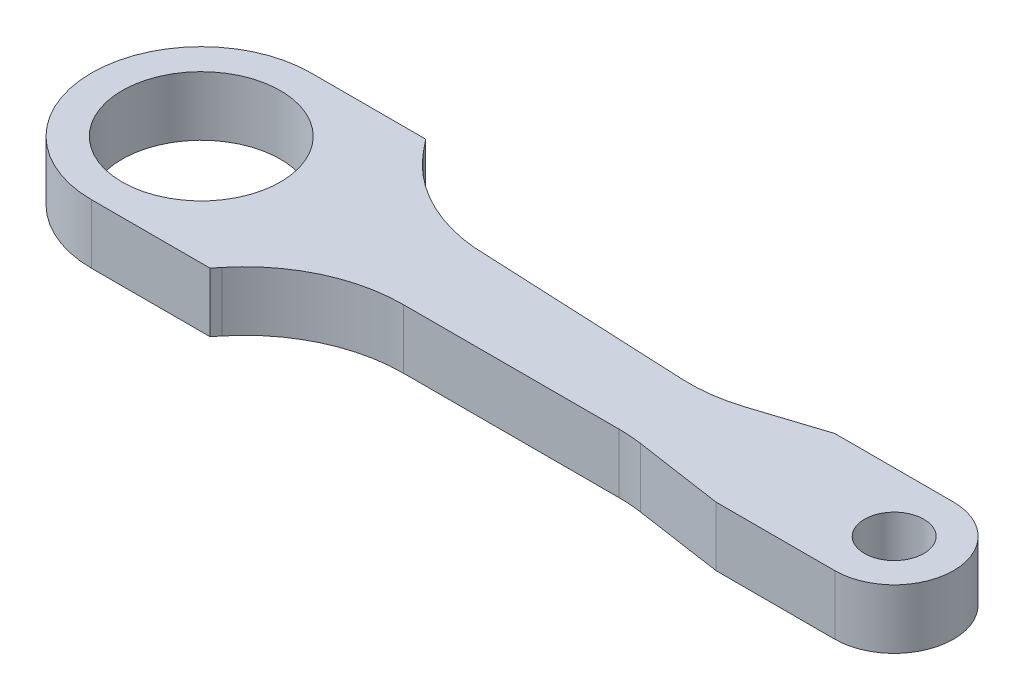
ISO-10303-21;
HEADER;
FILE_DESCRIPTION(('STEP AP214'),'2;1');
FILE_NAME('part.step','',(''),(''),'','','');
FILE_SCHEMA(('AUTOMOTIVE_DESIGN { 1 0 10303 214 1 1 1 1 }'));
ENDSEC;
DATA;
#1=APPLICATION_CONTEXT('core data for automotive mechanical design processes');
#2=APPLICATION_PROTOCOL_DEFINITION('international standard','automotive_design',2000,#1);
#3=PRODUCT_CONTEXT('',#1,'mechanical');
#4=PRODUCT('Part','Part','',(#3));
#5=PRODUCT_RELATED_PRODUCT_CATEGORY('part','',(#4));
#6=PRODUCT_DEFINITION_FORMATION('','',#4);
#7=PRODUCT_DEFINITION_CONTEXT('part definition',#1,'design');
#8=PRODUCT_DEFINITION('design','',#6,#7);
#9=PRODUCT_DEFINITION_SHAPE('','',#8);
#10=(LENGTH_UNIT() NAMED_UNIT(*) SI_UNIT(.MILLI.,.METRE.));
#11=(NAMED_UNIT(*) PLANE_ANGLE_UNIT() SI_UNIT($,.RADIAN.));
#12=(NAMED_UNIT(*) SI_UNIT($,.STERADIAN.) SOLID_ANGLE_UNIT());
#13=UNCERTAINTY_MEASURE_WITH_UNIT(LENGTH_MEASURE(1.E-05),#10,'distance_accuracy_value','');
#14=(GEOMETRIC_REPRESENTATION_CONTEXT(3) GLOBAL_UNCERTAINTY_ASSIGNED_CONTEXT((#13)) GLOBAL_UNIT_ASSIGNED_CONTEXT((#10,
#11,#12)) REPRESENTATION_CONTEXT('',''));
#15=CARTESIAN_POINT('',(0.,0.,0.));
#16=DIRECTION('',(0.,0.,1.));
#17=DIRECTION('',(1.,0.,0.));
#18=AXIS2_PLACEMENT_3D('',#15,#16,#17);
#19=CARTESIAN_POINT('',(-8.40404092998309,3.,-10.));
#20=DIRECTION('',(0.,-1.,0.));
#21=DIRECTION('',(0.,0.,-1.));
#22=AXIS2_PLACEMENT_3D('',#19,#20,#21);
#23=PLANE('',#22);
#24=CARTESIAN_POINT('',(-8.40404092998309,3.,-10.));
#25=DIRECTION('',(0.,-1.,0.));
#26=DIRECTION('',(0.,0.,-1.));
#27=AXIS2_PLACEMENT_3D('',#24,#25,#26);
#28=CIRCLE('',#27,8.);
#29=CARTESIAN_POINT('',(-8.40404092998305,3.,-2.));
#30=VERTEX_POINT('',#29);
#31=CARTESIAN_POINT('',(-14.6163644741254,3.,-4.9594607249923));
#32=VERTEX_POINT('',#31);
#33=EDGE_CURVE('E213',#30,#32,#28,.T.);
#34=ORIENTED_EDGE('',*,*,#33,.T.);
#35=DIRECTION('',(-0.630067409375966,0.,-0.776540443017786));
#36=VECTOR('',#35,1.);
#37=CARTESIAN_POINT('',(-14.6163644741254,3.,-4.9594607249923));
#38=LINE('',#37,#36);
#39=CARTESIAN_POINT('',(-15.0916254529327,3.,-5.54520657621413));
#40=VERTEX_POINT('',#39);
#41=EDGE_CURVE('E121',#32,#40,#38,.T.);
#42=ORIENTED_EDGE('',*,*,#41,.T.);
#43=DIRECTION('',(-1.,0.,0.));
#44=VECTOR('',#43,1.);
#45=CARTESIAN_POINT('',(-20.8830751260455,3.,-5.54520657621413));
#46=LINE('',#45,#44);
#47=CARTESIAN_POINT('',(-20.8830751260455,3.,-5.54520657621413));
#48=VERTEX_POINT('',#47);
#49=EDGE_CURVE('E252',#40,#48,#46,.T.);
#50=ORIENTED_EDGE('',*,*,#49,.T.);
#51=CARTESIAN_POINT('',(-20.8830751260455,3.,0.));
#52=DIRECTION('',(0.,1.,0.));
#53=DIRECTION('',(0.,0.,1.));
#54=AXIS2_PLACEMENT_3D('',#51,#52,#53);
#55=CIRCLE('',#54,5.54520657621413);
#56=CARTESIAN_POINT('',(-20.8830751260455,3.,5.54520657621413));
#57=VERTEX_POINT('',#56);
#58=EDGE_CURVE('E271',#48,#57,#55,.T.);
#59=ORIENTED_EDGE('',*,*,#58,.T.);
#60=DIRECTION('',(1.,0.,0.));
#61=VECTOR('',#60,1.);
#62=CARTESIAN_POINT('',(-20.8830751260455,3.,5.54520657621413));
#63=LINE('',#62,#61);
#64=CARTESIAN_POINT('',(-14.895018406666,3.,5.54520657621413));
#65=VERTEX_POINT('',#64);
#66=EDGE_CURVE('E268',#57,#65,#63,.T.);
#67=ORIENTED_EDGE('',*,*,#66,.T.);
#68=DIRECTION('',(0.630067409375964,0.,-0.776540443017787));
#69=VECTOR('',#68,1.);
#70=CARTESIAN_POINT('',(-14.6283077547458,3.,5.21649316441463));
#71=LINE('',#70,#69);
#72=CARTESIAN_POINT('',(-14.6283077547458,3.,5.21649316441463));
#73=VERTEX_POINT('',#72);
#74=EDGE_CURVE('E270',#65,#73,#71,.T.);
#75=ORIENTED_EDGE('',*,*,#74,.T.);
#76=CARTESIAN_POINT('',(-8.41598421060355,3.,10.2570324394224));
#77=DIRECTION('',(0.,-1.,0.));
#78=DIRECTION('',(0.,0.,-1.));
#79=AXIS2_PLACEMENT_3D('',#76,#77,#78);
#80=CIRCLE('',#79,8.);
#81=CARTESIAN_POINT('',(-8.41598421060348,3.,2.25703243942235));
#82=VERTEX_POINT('',#81);
#83=EDGE_CURVE('E273',#73,#82,#80,.T.);
#84=ORIENTED_EDGE('',*,*,#83,.T.);
#85=DIRECTION('',(1.,0.,0.));
#86=VECTOR('',#85,1.);
#87=CARTESIAN_POINT('',(2.48537587440996,3.,2.25703243942235));
#88=LINE('',#87,#86);
#89=CARTESIAN_POINT('',(2.48537587440996,3.,2.25703243942235));
#90=VERTEX_POINT('',#89);
#91=EDGE_CURVE('E279',#82,#90,#88,.T.);
#92=ORIENTED_EDGE('',*,*,#91,.T.);
#93=CARTESIAN_POINT('',(2.48537587440996,3.,10.2570324394224));
#94=DIRECTION('',(0.,-1.,0.));
#95=DIRECTION('',(0.,0.,1.));
#96=AXIS2_PLACEMENT_3D('',#93,#94,#95);
#97=CIRCLE('',#96,8.);
#98=CARTESIAN_POINT('',(3.65078649545687,3.,2.34237400810954));
#99=VERTEX_POINT('',#98);
#100=EDGE_CURVE('E281',#90,#99,#97,.T.);
#101=ORIENTED_EDGE('',*,*,#100,.T.);
#102=DIRECTION('',(0.989332303914102,0.,0.145676327630864));
#103=VECTOR('',#102,1.);
#104=CARTESIAN_POINT('',(8.11692487395447,3.,3.));
#105=LINE('',#104,#103);
#106=CARTESIAN_POINT('',(8.11692487395447,3.,3.));
#107=VERTEX_POINT('',#106);
#108=EDGE_CURVE('E283',#99,#107,#105,.T.);
#109=ORIENTED_EDGE('',*,*,#108,.T.);
#110=DIRECTION('',(1.,0.,0.));
#111=VECTOR('',#110,1.);
#112=CARTESIAN_POINT('',(14.1169248739545,3.,3.));
#113=LINE('',#112,#111);
#114=CARTESIAN_POINT('',(14.1169248739545,3.,3.));
#115=VERTEX_POINT('',#114);
#116=EDGE_CURVE('E285',#107,#115,#113,.T.);
#117=ORIENTED_EDGE('',*,*,#116,.T.);
#118=CARTESIAN_POINT('',(14.1169248739545,3.,0.));
#119=DIRECTION('',(0.,1.,0.));
#120=DIRECTION('',(0.,0.,1.));
#121=AXIS2_PLACEMENT_3D('',#118,#119,#120);
#122=CIRCLE('',#121,3.);
#123=CARTESIAN_POINT('',(14.1169248739545,3.,-3.));
#124=VERTEX_POINT('',#123);
#125=EDGE_CURVE('E287',#115,#124,#122,.T.);
#126=ORIENTED_EDGE('',*,*,#125,.T.);
#127=DIRECTION('',(-1.,0.,0.));
#128=VECTOR('',#127,1.);
#129=CARTESIAN_POINT('',(14.1169248739545,3.,-3.));
#130=LINE('',#129,#128);
#131=CARTESIAN_POINT('',(8.11692487395447,3.,-3.));
#132=VERTEX_POINT('',#131);
#133=EDGE_CURVE('E164',#124,#132,#130,.T.);
#134=ORIENTED_EDGE('',*,*,#133,.T.);
#135=DIRECTION('',(-0.951801168013499,0.,0.306715725987663));
#136=VECTOR('',#135,1.);
#137=CARTESIAN_POINT('',(8.11692487395447,3.,-3.));
#138=LINE('',#137,#136);
#139=CARTESIAN_POINT('',(4.70119470240216,3.,-1.89928884881262));
#140=VERTEX_POINT('',#139);
#141=EDGE_CURVE('E158',#132,#140,#138,.T.);
#142=ORIENTED_EDGE('',*,*,#141,.T.);
#143=CARTESIAN_POINT('',(2.24746889450082,3.,-9.5136981929206));
#144=DIRECTION('',(0.,-1.,0.));
#145=DIRECTION('',(0.,0.,-1.));
#146=AXIS2_PLACEMENT_3D('',#143,#144,#145);
#147=CIRCLE('',#146,8.);
#148=CARTESIAN_POINT('',(1.87614119252149,3.,-1.52232060593707));
#149=VERTEX_POINT('',#148);
#150=EDGE_CURVE('E162',#140,#149,#147,.T.);
#151=ORIENTED_EDGE('',*,*,#150,.T.);
#152=DIRECTION('',(-0.998922198372942,0.,-0.0464159627474137));
#153=VECTOR('',#152,1.);
#154=CARTESIAN_POINT('',(1.87614119252149,3.,-1.52232060593707));
#155=LINE('',#154,#153);
#156=EDGE_CURVE('E54',#149,#30,#155,.T.);
#157=ORIENTED_EDGE('',*,*,#156,.T.);
#158=EDGE_LOOP('',(#34,#42,#50,#59,#67,#75,#84,#92,#101,#109,#117,#126,#134,#142,#151,#157));
#159=FACE_BOUND('',#158,.T.);
#160=CARTESIAN_POINT('',(-20.8830751260455,3.,0.));
#161=DIRECTION('',(0.,1.,0.));
#162=DIRECTION('',(0.,0.,1.));
#163=AXIS2_PLACEMENT_3D('',#160,#161,#162);
#164=CIRCLE('',#163,4.);
#165=CARTESIAN_POINT('',(-20.8830751260455,3.,4.));
#166=VERTEX_POINT('',#165);
#167=EDGE_CURVE('E186',#166,#166,#164,.T.);
#168=ORIENTED_EDGE('',*,*,#167,.F.);
#169=EDGE_LOOP('',(#168));
#170=FACE_BOUND('',#169,.T.);
#171=CARTESIAN_POINT('',(14.1169248739545,3.,0.));
#172=DIRECTION('',(0.,1.,0.));
#173=DIRECTION('',(0.,0.,1.));
#174=AXIS2_PLACEMENT_3D('',#171,#172,#173);
#175=CIRCLE('',#174,1.5);
#176=CARTESIAN_POINT('',(14.1169248739545,3.,1.5));
#177=VERTEX_POINT('',#176);
#178=EDGE_CURVE('E328',#177,#177,#175,.T.);
#179=ORIENTED_EDGE('',*,*,#178,.F.);
#180=EDGE_LOOP('',(#179));
#181=FACE_BOUND('',#180,.T.);
#182=ADVANCED_FACE('F37',(#159,#170,#181),#23,.F.);
#183=CARTESIAN_POINT('',(-8.40404092998309,0.,-10.));
#184=DIRECTION('',(0.,-1.,0.));
#185=DIRECTION('',(0.,0.,-1.));
#186=AXIS2_PLACEMENT_3D('',#183,#184,#185);
#187=PLANE('',#186);
#188=CARTESIAN_POINT('',(-20.8830751260455,0.,0.));
#189=DIRECTION('',(0.,1.,0.));
#190=DIRECTION('',(0.,0.,1.));
#191=AXIS2_PLACEMENT_3D('',#188,#189,#190);
#192=CIRCLE('',#191,4.);
#193=CARTESIAN_POINT('',(-20.8830751260455,0.,4.));
#194=VERTEX_POINT('',#193);
#195=EDGE_CURVE('E333',#194,#194,#192,.T.);
#196=ORIENTED_EDGE('',*,*,#195,.T.);
#197=EDGE_LOOP('',(#196));
#198=FACE_BOUND('',#197,.T.);
#199=CARTESIAN_POINT('',(-8.40404092998309,0.,-10.));
#200=DIRECTION('',(0.,-1.,0.));
#201=DIRECTION('',(0.,0.,-1.));
#202=AXIS2_PLACEMENT_3D('',#199,#200,#201);
#203=CIRCLE('',#202,8.);
#204=CARTESIAN_POINT('',(-8.40404092998305,0.,-2.));
#205=VERTEX_POINT('',#204);
#206=CARTESIAN_POINT('',(-14.6163644741254,0.,-4.9594607249923));
#207=VERTEX_POINT('',#206);
#208=EDGE_CURVE('E182',#205,#207,#203,.T.);
#209=ORIENTED_EDGE('',*,*,#208,.F.);
#210=DIRECTION('',(-0.998922198372942,0.,-0.0464159627474137));
#211=VECTOR('',#210,1.);
#212=CARTESIAN_POINT('',(1.87614119252149,0.,-1.52232060593707));
#213=LINE('',#212,#211);
#214=CARTESIAN_POINT('',(1.87614119252149,0.,-1.52232060593707));
#215=VERTEX_POINT('',#214);
#216=EDGE_CURVE('E113',#215,#205,#213,.T.);
#217=ORIENTED_EDGE('',*,*,#216,.F.);
#218=CARTESIAN_POINT('',(2.24746889450082,0.,-9.5136981929206));
#219=DIRECTION('',(0.,-1.,0.));
#220=DIRECTION('',(0.,0.,-1.));
#221=AXIS2_PLACEMENT_3D('',#218,#219,#220);
#222=CIRCLE('',#221,8.);
#223=CARTESIAN_POINT('',(4.70119470240216,0.,-1.89928884881262));
#224=VERTEX_POINT('',#223);
#225=EDGE_CURVE('E107',#224,#215,#222,.T.);
#226=ORIENTED_EDGE('',*,*,#225,.F.);
#227=DIRECTION('',(-0.951801168013499,0.,0.306715725987663));
#228=VECTOR('',#227,1.);
#229=CARTESIAN_POINT('',(8.11692487395447,0.,-3.));
#230=LINE('',#229,#228);
#231=CARTESIAN_POINT('',(8.11692487395447,0.,-3.));
#232=VERTEX_POINT('',#231);
#233=EDGE_CURVE('E172',#232,#224,#230,.T.);
#234=ORIENTED_EDGE('',*,*,#233,.F.);
#235=DIRECTION('',(-1.,0.,0.));
#236=VECTOR('',#235,1.);
#237=CARTESIAN_POINT('',(14.1169248739545,0.,-3.));
#238=LINE('',#237,#236);
#239=CARTESIAN_POINT('',(14.1169248739545,0.,-3.));
#240=VERTEX_POINT('',#239);
#241=EDGE_CURVE('E208',#240,#232,#238,.T.);
#242=ORIENTED_EDGE('',*,*,#241,.F.);
#243=CARTESIAN_POINT('',(14.1169248739545,0.,0.));
#244=DIRECTION('',(0.,1.,0.));
#245=DIRECTION('',(0.,0.,1.));
#246=AXIS2_PLACEMENT_3D('',#243,#244,#245);
#247=CIRCLE('',#246,3.);
#248=CARTESIAN_POINT('',(14.1169248739545,0.,3.));
#249=VERTEX_POINT('',#248);
#250=EDGE_CURVE('E206',#249,#240,#247,.T.);
#251=ORIENTED_EDGE('',*,*,#250,.F.);
#252=DIRECTION('',(1.,0.,0.));
#253=VECTOR('',#252,1.);
#254=CARTESIAN_POINT('',(14.1169248739545,0.,3.));
#255=LINE('',#254,#253);
#256=CARTESIAN_POINT('',(8.11692487395447,0.,3.));
#257=VERTEX_POINT('',#256);
#258=EDGE_CURVE('E204',#257,#249,#255,.T.);
#259=ORIENTED_EDGE('',*,*,#258,.F.);
#260=DIRECTION('',(0.989332303914102,0.,0.145676327630864));
#261=VECTOR('',#260,1.);
#262=CARTESIAN_POINT('',(8.11692487395447,0.,3.));
#263=LINE('',#262,#261);
#264=CARTESIAN_POINT('',(3.65078649545687,0.,2.34237400810954));
#265=VERTEX_POINT('',#264);
#266=EDGE_CURVE('E202',#265,#257,#263,.T.);
#267=ORIENTED_EDGE('',*,*,#266,.F.);
#268=CARTESIAN_POINT('',(2.48537587440996,0.,10.2570324394224));
#269=DIRECTION('',(0.,-1.,0.));
#270=DIRECTION('',(0.,0.,1.));
#271=AXIS2_PLACEMENT_3D('',#268,#269,#270);
#272=CIRCLE('',#271,8.);
#273=CARTESIAN_POINT('',(2.48537587440996,0.,2.25703243942235));
#274=VERTEX_POINT('',#273);
#275=EDGE_CURVE('E200',#274,#265,#272,.T.);
#276=ORIENTED_EDGE('',*,*,#275,.F.);
#277=DIRECTION('',(1.,0.,0.));
#278=VECTOR('',#277,1.);
#279=CARTESIAN_POINT('',(2.48537587440996,0.,2.25703243942235));
#280=LINE('',#279,#278);
#281=CARTESIAN_POINT('',(-8.41598421060348,0.,2.25703243942235));
#282=VERTEX_POINT('',#281);
#283=EDGE_CURVE('E198',#282,#274,#280,.T.);
#284=ORIENTED_EDGE('',*,*,#283,.F.);
#285=CARTESIAN_POINT('',(-8.41598421060355,0.,10.2570324394224));
#286=DIRECTION('',(0.,-1.,0.));
#287=DIRECTION('',(0.,0.,-1.));
#288=AXIS2_PLACEMENT_3D('',#285,#286,#287);
#289=CIRCLE('',#288,8.);
#290=CARTESIAN_POINT('',(-14.6283077547458,0.,5.21649316441463));
#291=VERTEX_POINT('',#290);
#292=EDGE_CURVE('E196',#291,#282,#289,.T.);
#293=ORIENTED_EDGE('',*,*,#292,.F.);
#294=DIRECTION('',(0.630067409375964,0.,-0.776540443017787));
#295=VECTOR('',#294,1.);
#296=CARTESIAN_POINT('',(-14.6283077547458,0.,5.21649316441463));
#297=LINE('',#296,#295);
#298=CARTESIAN_POINT('',(-14.895018406666,0.,5.54520657621413));
#299=VERTEX_POINT('',#298);
#300=EDGE_CURVE('E194',#299,#291,#297,.T.);
#301=ORIENTED_EDGE('',*,*,#300,.F.);
#302=DIRECTION('',(1.,0.,0.));
#303=VECTOR('',#302,1.);
#304=CARTESIAN_POINT('',(-20.8830751260455,0.,5.54520657621413));
#305=LINE('',#304,#303);
#306=CARTESIAN_POINT('',(-20.8830751260455,0.,5.54520657621413));
#307=VERTEX_POINT('',#306);
#308=EDGE_CURVE('E192',#307,#299,#305,.T.);
#309=ORIENTED_EDGE('',*,*,#308,.F.);
#310=CARTESIAN_POINT('',(-20.8830751260455,0.,0.));
#311=DIRECTION('',(0.,1.,0.));
#312=DIRECTION('',(0.,0.,1.));
#313=AXIS2_PLACEMENT_3D('',#310,#311,#312);
#314=CIRCLE('',#313,5.54520657621413);
#315=CARTESIAN_POINT('',(-20.8830751260455,0.,-5.54520657621413));
#316=VERTEX_POINT('',#315);
#317=EDGE_CURVE('E190',#316,#307,#314,.T.);
#318=ORIENTED_EDGE('',*,*,#317,.F.);
#319=DIRECTION('',(-1.,0.,0.));
#320=VECTOR('',#319,1.);
#321=CARTESIAN_POINT('',(-20.8830751260455,0.,-5.54520657621413));
#322=LINE('',#321,#320);
#323=CARTESIAN_POINT('',(-15.0916254529327,0.,-5.54520657621413));
#324=VERTEX_POINT('',#323);
#325=EDGE_CURVE('E188',#324,#316,#322,.T.);
#326=ORIENTED_EDGE('',*,*,#325,.F.);
#327=DIRECTION('',(-0.630067409375966,0.,-0.776540443017786));
#328=VECTOR('',#327,1.);
#329=CARTESIAN_POINT('',(-14.6163644741254,0.,-4.9594607249923));
#330=LINE('',#329,#328);
#331=EDGE_CURVE('E185',#207,#324,#330,.T.);
#332=ORIENTED_EDGE('',*,*,#331,.F.);
#333=EDGE_LOOP('',(#209,#217,#226,#234,#242,#251,#259,#267,#276,#284,#293,#301,#309,#318,#326,#332));
#334=FACE_BOUND('',#333,.T.);
#335=CARTESIAN_POINT('',(14.1169248739545,0.,0.));
#336=DIRECTION('',(0.,1.,0.));
#337=DIRECTION('',(0.,0.,1.));
#338=AXIS2_PLACEMENT_3D('',#335,#336,#337);
#339=CIRCLE('',#338,1.5);
#340=CARTESIAN_POINT('',(14.1169248739545,0.,1.5));
#341=VERTEX_POINT('',#340);
#342=EDGE_CURVE('E331',#341,#341,#339,.T.);
#343=ORIENTED_EDGE('',*,*,#342,.T.);
#344=EDGE_LOOP('',(#343));
#345=FACE_BOUND('',#344,.T.);
#346=ADVANCED_FACE('F256',(#198,#334,#345),#187,.T.);
#347=CARTESIAN_POINT('',(-8.40404092998309,3.,-10.));
#348=DIRECTION('',(0.,-1.,0.));
#349=DIRECTION('',(0.,0.,-1.));
#350=AXIS2_PLACEMENT_3D('',#347,#348,#349);
#351=CYLINDRICAL_SURFACE('',#350,8.);
#352=ORIENTED_EDGE('',*,*,#208,.T.);
#353=DIRECTION('',(0.,-1.,0.));
#354=VECTOR('',#353,1.);
#355=CARTESIAN_POINT('',(-14.6163644741254,3.,-4.9594607249923));
#356=LINE('',#355,#354);
#357=EDGE_CURVE('E11',#32,#207,#356,.T.);
#358=ORIENTED_EDGE('',*,*,#357,.F.);
#359=ORIENTED_EDGE('',*,*,#33,.F.);
#360=DIRECTION('',(0.,-1.,0.));
#361=VECTOR('',#360,1.);
#362=CARTESIAN_POINT('',(-8.40404092998305,3.,-2.));
#363=LINE('',#362,#361);
#364=EDGE_CURVE('E178',#30,#205,#363,.T.);
#365=ORIENTED_EDGE('',*,*,#364,.T.);
#366=EDGE_LOOP('',(#352,#358,#359,#365));
#367=FACE_BOUND('',#366,.T.);
#368=ADVANCED_FACE('F39',(#367),#351,.F.);
#369=CARTESIAN_POINT('',(-14.6163644741254,3.,-4.9594607249923));
#370=DIRECTION('',(-0.776540443017786,0.,0.630067409375966));
#371=DIRECTION('',(0.630067409375966,0.,0.776540443017786));
#372=AXIS2_PLACEMENT_3D('',#369,#370,#371);
#373=PLANE('',#372);
#374=ORIENTED_EDGE('',*,*,#331,.T.);
#375=DIRECTION('',(0.,-1.,0.));
#376=VECTOR('',#375,1.);
#377=CARTESIAN_POINT('',(-15.0916254529327,3.,-5.54520657621413));
#378=LINE('',#377,#376);
#379=EDGE_CURVE('E46',#40,#324,#378,.T.);
#380=ORIENTED_EDGE('',*,*,#379,.F.);
#381=ORIENTED_EDGE('',*,*,#41,.F.);
#382=ORIENTED_EDGE('',*,*,#357,.T.);
#383=EDGE_LOOP('',(#374,#380,#381,#382));
#384=FACE_BOUND('',#383,.T.);
#385=ADVANCED_FACE('F482',(#384),#373,.F.);
#386=CARTESIAN_POINT('',(-20.8830751260455,3.,-5.54520657621413));
#387=DIRECTION('',(0.,0.,1.));
#388=DIRECTION('',(1.,0.,0.));
#389=AXIS2_PLACEMENT_3D('',#386,#387,#388);
#390=PLANE('',#389);
#391=ORIENTED_EDGE('',*,*,#325,.T.);
#392=DIRECTION('',(0.,-1.,0.));
#393=VECTOR('',#392,1.);
#394=CARTESIAN_POINT('',(-20.8830751260455,3.,-5.54520657621413));
#395=LINE('',#394,#393);
#396=EDGE_CURVE('E244',#48,#316,#395,.T.);
#397=ORIENTED_EDGE('',*,*,#396,.F.);
#398=ORIENTED_EDGE('',*,*,#49,.F.);
#399=ORIENTED_EDGE('',*,*,#379,.T.);
#400=EDGE_LOOP('',(#391,#397,#398,#399));
#401=FACE_BOUND('',#400,.T.);
#402=ADVANCED_FACE('F250',(#401),#390,.F.);
#403=CARTESIAN_POINT('',(-20.8830751260455,3.,0.));
#404=DIRECTION('',(0.,-1.,0.));
#405=DIRECTION('',(0.,0.,-1.));
#406=AXIS2_PLACEMENT_3D('',#403,#404,#405);
#407=CYLINDRICAL_SURFACE('',#406,5.54520657621413);
#408=ORIENTED_EDGE('',*,*,#317,.T.);
#409=DIRECTION('',(0.,-1.,0.));
#410=VECTOR('',#409,1.);
#411=CARTESIAN_POINT('',(-20.8830751260455,3.,5.54520657621413));
#412=LINE('',#411,#410);
#413=EDGE_CURVE('E241',#57,#307,#412,.T.);
#414=ORIENTED_EDGE('',*,*,#413,.F.);
#415=ORIENTED_EDGE('',*,*,#58,.F.);
#416=ORIENTED_EDGE('',*,*,#396,.T.);
#417=EDGE_LOOP('',(#408,#414,#415,#416));
#418=FACE_BOUND('',#417,.T.);
#419=ADVANCED_FACE('F262',(#418),#407,.T.);
#420=CARTESIAN_POINT('',(-20.8830751260455,3.,5.54520657621413));
#421=DIRECTION('',(0.,0.,-1.));
#422=DIRECTION('',(-1.,0.,0.));
#423=AXIS2_PLACEMENT_3D('',#420,#421,#422);
#424=PLANE('',#423);
#425=ORIENTED_EDGE('',*,*,#308,.T.);
#426=DIRECTION('',(0.,-1.,0.));
#427=VECTOR('',#426,1.);
#428=CARTESIAN_POINT('',(-14.895018406666,3.,5.54520657621413));
#429=LINE('',#428,#427);
#430=EDGE_CURVE('E238',#65,#299,#429,.T.);
#431=ORIENTED_EDGE('',*,*,#430,.F.);
#432=ORIENTED_EDGE('',*,*,#66,.F.);
#433=ORIENTED_EDGE('',*,*,#413,.T.);
#434=EDGE_LOOP('',(#425,#431,#432,#433));
#435=FACE_BOUND('',#434,.T.);
#436=ADVANCED_FACE('F266',(#435),#424,.F.);
#437=CARTESIAN_POINT('',(-14.6283077547458,3.,5.21649316441463));
#438=DIRECTION('',(-0.776540443017787,0.,-0.630067409375964));
#439=DIRECTION('',(-0.630067409375964,0.,0.776540443017787));
#440=AXIS2_PLACEMENT_3D('',#437,#438,#439);
#441=PLANE('',#440);
#442=ORIENTED_EDGE('',*,*,#300,.T.);
#443=DIRECTION('',(0.,-1.,0.));
#444=VECTOR('',#443,1.);
#445=CARTESIAN_POINT('',(-14.6283077547458,3.,5.21649316441463));
#446=LINE('',#445,#444);
#447=EDGE_CURVE('E235',#73,#291,#446,.T.);
#448=ORIENTED_EDGE('',*,*,#447,.F.);
#449=ORIENTED_EDGE('',*,*,#74,.F.);
#450=ORIENTED_EDGE('',*,*,#430,.T.);
#451=EDGE_LOOP('',(#442,#448,#449,#450));
#452=FACE_BOUND('',#451,.T.);
#453=ADVANCED_FACE('F443',(#452),#441,.F.);
#454=CARTESIAN_POINT('',(-8.41598421060355,3.,10.2570324394224));
#455=DIRECTION('',(0.,-1.,0.));
#456=DIRECTION('',(0.,0.,-1.));
#457=AXIS2_PLACEMENT_3D('',#454,#455,#456);
#458=CYLINDRICAL_SURFACE('',#457,8.);
#459=ORIENTED_EDGE('',*,*,#292,.T.);
#460=DIRECTION('',(0.,-1.,0.));
#461=VECTOR('',#460,1.);
#462=CARTESIAN_POINT('',(-8.41598421060348,3.,2.25703243942235));
#463=LINE('',#462,#461);
#464=EDGE_CURVE('E232',#82,#282,#463,.T.);
#465=ORIENTED_EDGE('',*,*,#464,.F.);
#466=ORIENTED_EDGE('',*,*,#83,.F.);
#467=ORIENTED_EDGE('',*,*,#447,.T.);
#468=EDGE_LOOP('',(#459,#465,#466,#467));
#469=FACE_BOUND('',#468,.T.);
#470=ADVANCED_FACE('F432',(#469),#458,.F.);
#471=CARTESIAN_POINT('',(2.48537587440996,3.,2.25703243942235));
#472=DIRECTION('',(0.,0.,-1.));
#473=DIRECTION('',(-1.,0.,0.));
#474=AXIS2_PLACEMENT_3D('',#471,#472,#473);
#475=PLANE('',#474);
#476=ORIENTED_EDGE('',*,*,#283,.T.);
#477=DIRECTION('',(0.,-1.,0.));
#478=VECTOR('',#477,1.);
#479=CARTESIAN_POINT('',(2.48537587440996,3.,2.25703243942235));
#480=LINE('',#479,#478);
#481=EDGE_CURVE('E229',#90,#274,#480,.T.);
#482=ORIENTED_EDGE('',*,*,#481,.F.);
#483=ORIENTED_EDGE('',*,*,#91,.F.);
#484=ORIENTED_EDGE('',*,*,#464,.T.);
#485=EDGE_LOOP('',(#476,#482,#483,#484));
#486=FACE_BOUND('',#485,.T.);
#487=ADVANCED_FACE('F421',(#486),#475,.F.);
#488=CARTESIAN_POINT('',(2.48537587440996,3.,10.2570324394224));
#489=DIRECTION('',(0.,-1.,0.));
#490=DIRECTION('',(0.,0.,-1.));
#491=AXIS2_PLACEMENT_3D('',#488,#489,#490);
#492=CYLINDRICAL_SURFACE('',#491,8.);
#493=ORIENTED_EDGE('',*,*,#275,.T.);
#494=DIRECTION('',(0.,-1.,0.));
#495=VECTOR('',#494,1.);
#496=CARTESIAN_POINT('',(3.65078649545687,3.,2.34237400810954));
#497=LINE('',#496,#495);
#498=EDGE_CURVE('E226',#99,#265,#497,.T.);
#499=ORIENTED_EDGE('',*,*,#498,.F.);
#500=ORIENTED_EDGE('',*,*,#100,.F.);
#501=ORIENTED_EDGE('',*,*,#481,.T.);
#502=EDGE_LOOP('',(#493,#499,#500,#501));
#503=FACE_BOUND('',#502,.T.);
#504=ADVANCED_FACE('F410',(#503),#492,.F.);
#505=CARTESIAN_POINT('',(8.11692487395447,3.,3.));
#506=DIRECTION('',(0.145676327630864,0.,-0.989332303914102));
#507=DIRECTION('',(-0.989332303914102,0.,-0.145676327630864));
#508=AXIS2_PLACEMENT_3D('',#505,#506,#507);
#509=PLANE('',#508);
#510=ORIENTED_EDGE('',*,*,#266,.T.);
#511=DIRECTION('',(0.,-1.,0.));
#512=VECTOR('',#511,1.);
#513=CARTESIAN_POINT('',(8.11692487395447,3.,3.));
#514=LINE('',#513,#512);
#515=EDGE_CURVE('E223',#107,#257,#514,.T.);
#516=ORIENTED_EDGE('',*,*,#515,.F.);
#517=ORIENTED_EDGE('',*,*,#108,.F.);
#518=ORIENTED_EDGE('',*,*,#498,.T.);
#519=EDGE_LOOP('',(#510,#516,#517,#518));
#520=FACE_BOUND('',#519,.T.);
#521=ADVANCED_FACE('F399',(#520),#509,.F.);
#522=CARTESIAN_POINT('',(14.1169248739545,3.,3.));
#523=DIRECTION('',(0.,0.,-1.));
#524=DIRECTION('',(-1.,0.,0.));
#525=AXIS2_PLACEMENT_3D('',#522,#523,#524);
#526=PLANE('',#525);
#527=ORIENTED_EDGE('',*,*,#258,.T.);
#528=DIRECTION('',(0.,-1.,0.));
#529=VECTOR('',#528,1.);
#530=CARTESIAN_POINT('',(14.1169248739545,3.,3.));
#531=LINE('',#530,#529);
#532=EDGE_CURVE('E220',#115,#249,#531,.T.);
#533=ORIENTED_EDGE('',*,*,#532,.F.);
#534=ORIENTED_EDGE('',*,*,#116,.F.);
#535=ORIENTED_EDGE('',*,*,#515,.T.);
#536=EDGE_LOOP('',(#527,#533,#534,#535));
#537=FACE_BOUND('',#536,.T.);
#538=ADVANCED_FACE('F389',(#537),#526,.F.);
#539=CARTESIAN_POINT('',(14.1169248739545,3.,0.));
#540=DIRECTION('',(0.,-1.,0.));
#541=DIRECTION('',(0.,0.,-1.));
#542=AXIS2_PLACEMENT_3D('',#539,#540,#541);
#543=CYLINDRICAL_SURFACE('',#542,3.);
#544=ORIENTED_EDGE('',*,*,#250,.T.);
#545=DIRECTION('',(0.,-1.,0.));
#546=VECTOR('',#545,1.);
#547=CARTESIAN_POINT('',(14.1169248739545,3.,-3.));
#548=LINE('',#547,#546);
#549=EDGE_CURVE('E217',#124,#240,#548,.T.);
#550=ORIENTED_EDGE('',*,*,#549,.F.);
#551=ORIENTED_EDGE('',*,*,#125,.F.);
#552=ORIENTED_EDGE('',*,*,#532,.T.);
#553=EDGE_LOOP('',(#544,#550,#551,#552));
#554=FACE_BOUND('',#553,.T.);
#555=ADVANCED_FACE('F293',(#554),#543,.T.);
#556=CARTESIAN_POINT('',(14.1169248739545,3.,-3.));
#557=DIRECTION('',(0.,0.,1.));
#558=DIRECTION('',(1.,0.,0.));
#559=AXIS2_PLACEMENT_3D('',#556,#557,#558);
#560=PLANE('',#559);
#561=ORIENTED_EDGE('',*,*,#241,.T.);
#562=DIRECTION('',(0.,-1.,0.));
#563=VECTOR('',#562,1.);
#564=CARTESIAN_POINT('',(8.11692487395447,3.,-3.));
#565=LINE('',#564,#563);
#566=EDGE_CURVE('E173',#132,#232,#565,.T.);
#567=ORIENTED_EDGE('',*,*,#566,.F.);
#568=ORIENTED_EDGE('',*,*,#133,.F.);
#569=ORIENTED_EDGE('',*,*,#549,.T.);
#570=EDGE_LOOP('',(#561,#567,#568,#569));
#571=FACE_BOUND('',#570,.T.);
#572=ADVANCED_FACE('F297',(#571),#560,.F.);
#573=CARTESIAN_POINT('',(8.11692487395447,3.,-3.));
#574=DIRECTION('',(0.306715725987663,0.,0.951801168013499));
#575=DIRECTION('',(0.951801168013499,0.,-0.306715725987663));
#576=AXIS2_PLACEMENT_3D('',#573,#574,#575);
#577=PLANE('',#576);
#578=ORIENTED_EDGE('',*,*,#233,.T.);
#579=DIRECTION('',(0.,-1.,0.));
#580=VECTOR('',#579,1.);
#581=CARTESIAN_POINT('',(4.70119470240216,3.,-1.89928884881262));
#582=LINE('',#581,#580);
#583=EDGE_CURVE('E169',#140,#224,#582,.T.);
#584=ORIENTED_EDGE('',*,*,#583,.F.);
#585=ORIENTED_EDGE('',*,*,#141,.F.);
#586=ORIENTED_EDGE('',*,*,#566,.T.);
#587=EDGE_LOOP('',(#578,#584,#585,#586));
#588=FACE_BOUND('',#587,.T.);
#589=ADVANCED_FACE('F170',(#588),#577,.F.);
#590=CARTESIAN_POINT('',(2.24746889450082,3.,-9.5136981929206));
#591=DIRECTION('',(0.,-1.,0.));
#592=DIRECTION('',(0.,0.,-1.));
#593=AXIS2_PLACEMENT_3D('',#590,#591,#592);
#594=CYLINDRICAL_SURFACE('',#593,8.);
#595=ORIENTED_EDGE('',*,*,#225,.T.);
#596=DIRECTION('',(0.,-1.,0.));
#597=VECTOR('',#596,1.);
#598=CARTESIAN_POINT('',(1.87614119252149,3.,-1.52232060593707));
#599=LINE('',#598,#597);
#600=EDGE_CURVE('E174',#149,#215,#599,.T.);
#601=ORIENTED_EDGE('',*,*,#600,.F.);
#602=ORIENTED_EDGE('',*,*,#150,.F.);
#603=ORIENTED_EDGE('',*,*,#583,.T.);
#604=EDGE_LOOP('',(#595,#601,#602,#603));
#605=FACE_BOUND('',#604,.T.);
#606=ADVANCED_FACE('F176',(#605),#594,.F.);
#607=CARTESIAN_POINT('',(1.87614119252149,3.,-1.52232060593707));
#608=DIRECTION('',(-0.0464159627474136,0.,0.998922198372942));
#609=DIRECTION('',(0.998922198372942,0.,0.0464159627474136));
#610=AXIS2_PLACEMENT_3D('',#607,#608,#609);
#611=PLANE('',#610);
#612=ORIENTED_EDGE('',*,*,#216,.T.);
#613=ORIENTED_EDGE('',*,*,#364,.F.);
#614=ORIENTED_EDGE('',*,*,#156,.F.);
#615=ORIENTED_EDGE('',*,*,#600,.T.);
#616=EDGE_LOOP('',(#612,#613,#614,#615));
#617=FACE_BOUND('',#616,.T.);
#618=ADVANCED_FACE('F301',(#617),#611,.F.);
#619=CARTESIAN_POINT('',(-20.8830751260455,3.,0.));
#620=DIRECTION('',(0.,-1.,0.));
#621=DIRECTION('',(0.,0.,-1.));
#622=AXIS2_PLACEMENT_3D('',#619,#620,#621);
#623=CYLINDRICAL_SURFACE('',#622,4.);
#624=ORIENTED_EDGE('',*,*,#167,.T.);
#625=EDGE_LOOP('',(#624));
#626=FACE_BOUND('',#625,.T.);
#627=ORIENTED_EDGE('',*,*,#195,.F.);
#628=EDGE_LOOP('',(#627));
#629=FACE_BOUND('',#628,.T.);
#630=ADVANCED_FACE('F303',(#626,#629),#623,.F.);
#631=CARTESIAN_POINT('',(14.1169248739545,3.,0.));
#632=DIRECTION('',(0.,-1.,0.));
#633=DIRECTION('',(0.,0.,-1.));
#634=AXIS2_PLACEMENT_3D('',#631,#632,#633);
#635=CYLINDRICAL_SURFACE('',#634,1.5);
#636=ORIENTED_EDGE('',*,*,#178,.T.);
#637=EDGE_LOOP('',(#636));
#638=FACE_BOUND('',#637,.T.);
#639=ORIENTED_EDGE('',*,*,#342,.F.);
#640=EDGE_LOOP('',(#639));
#641=FACE_BOUND('',#640,.T.);
#642=ADVANCED_FACE('F309',(#638,#641),#635,.F.);
#643=CLOSED_SHELL('',(#182,#346,#368,#385,#402,#419,#436,#453,#470,#487,#504,#521,#538,#555,
#572,#589,#606,#618,#630,#642));
#644=MANIFOLD_SOLID_BREP('B2',#643);
#645=ADVANCED_BREP_SHAPE_REPRESENTATION('',(#18,#644),#14);
#646=SHAPE_DEFINITION_REPRESENTATION(#9,#645);
ENDSEC;
END-ISO-10303-21;
